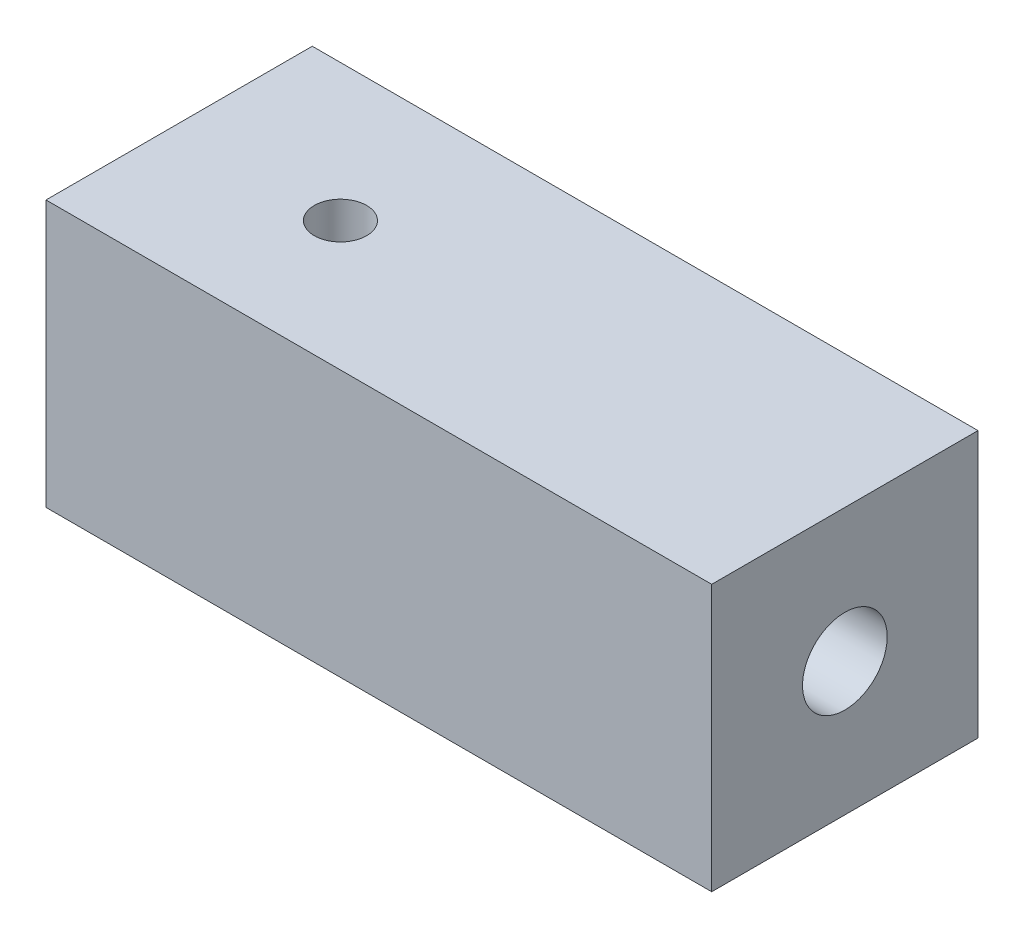
ISO-10303-21;
HEADER;
FILE_DESCRIPTION(('STEP AP214'),'2;1');
FILE_NAME('part.step','',(''),(''),'','','');
FILE_SCHEMA(('AUTOMOTIVE_DESIGN { 1 0 10303 214 1 1 1 1 }'));
ENDSEC;
DATA;
#1=APPLICATION_CONTEXT('core data for automotive mechanical design processes');
#2=APPLICATION_PROTOCOL_DEFINITION('international standard','automotive_design',2000,#1);
#3=PRODUCT_CONTEXT('',#1,'mechanical');
#4=PRODUCT('Part','Part','',(#3));
#5=PRODUCT_RELATED_PRODUCT_CATEGORY('part','',(#4));
#6=PRODUCT_DEFINITION_FORMATION('','',#4);
#7=PRODUCT_DEFINITION_CONTEXT('part definition',#1,'design');
#8=PRODUCT_DEFINITION('design','',#6,#7);
#9=PRODUCT_DEFINITION_SHAPE('','',#8);
#10=(LENGTH_UNIT() NAMED_UNIT(*) SI_UNIT(.MILLI.,.METRE.));
#11=(NAMED_UNIT(*) PLANE_ANGLE_UNIT() SI_UNIT($,.RADIAN.));
#12=(NAMED_UNIT(*) SI_UNIT($,.STERADIAN.) SOLID_ANGLE_UNIT());
#13=UNCERTAINTY_MEASURE_WITH_UNIT(LENGTH_MEASURE(1.E-05),#10,'distance_accuracy_value','');
#14=(GEOMETRIC_REPRESENTATION_CONTEXT(3) GLOBAL_UNCERTAINTY_ASSIGNED_CONTEXT((#13)) GLOBAL_UNIT_ASSIGNED_CONTEXT((#10,
#11,#12)) REPRESENTATION_CONTEXT('',''));
#15=CARTESIAN_POINT('',(0.,0.,0.));
#16=DIRECTION('',(0.,0.,1.));
#17=DIRECTION('',(1.,0.,0.));
#18=AXIS2_PLACEMENT_3D('',#15,#16,#17);
#19=CARTESIAN_POINT('',(31.75,0.,0.));
#20=DIRECTION('',(0.,0.,-1.));
#21=DIRECTION('',(-1.,0.,0.));
#22=AXIS2_PLACEMENT_3D('',#19,#20,#21);
#23=PLANE('',#22);
#24=DIRECTION('',(0.,-1.,0.));
#25=VECTOR('',#24,1.);
#26=CARTESIAN_POINT('',(0.,0.,0.));
#27=LINE('',#26,#25);
#28=CARTESIAN_POINT('',(0.,12.7,0.));
#29=VERTEX_POINT('',#28);
#30=CARTESIAN_POINT('',(0.,0.,0.));
#31=VERTEX_POINT('',#30);
#32=EDGE_CURVE('E94',#29,#31,#27,.T.);
#33=ORIENTED_EDGE('',*,*,#32,.T.);
#34=DIRECTION('',(-1.,0.,0.));
#35=VECTOR('',#34,1.);
#36=CARTESIAN_POINT('',(31.75,0.,0.));
#37=LINE('',#36,#35);
#38=CARTESIAN_POINT('',(31.75,0.,0.));
#39=VERTEX_POINT('',#38);
#40=EDGE_CURVE('E11',#39,#31,#37,.T.);
#41=ORIENTED_EDGE('',*,*,#40,.F.);
#42=DIRECTION('',(0.,-1.,0.));
#43=VECTOR('',#42,1.);
#44=CARTESIAN_POINT('',(31.75,0.,0.));
#45=LINE('',#44,#43);
#46=CARTESIAN_POINT('',(31.75,12.7,0.));
#47=VERTEX_POINT('',#46);
#48=EDGE_CURVE('E105',#47,#39,#45,.T.);
#49=ORIENTED_EDGE('',*,*,#48,.F.);
#50=DIRECTION('',(-1.,0.,0.));
#51=VECTOR('',#50,1.);
#52=CARTESIAN_POINT('',(31.75,12.7,0.));
#53=LINE('',#52,#51);
#54=EDGE_CURVE('E110',#47,#29,#53,.T.);
#55=ORIENTED_EDGE('',*,*,#54,.T.);
#56=EDGE_LOOP('',(#33,#41,#49,#55));
#57=FACE_BOUND('',#56,.T.);
#58=ADVANCED_FACE('F33',(#57),#23,.F.);
#59=CARTESIAN_POINT('',(31.75,0.,0.));
#60=DIRECTION('',(0.,1.,0.));
#61=DIRECTION('',(0.,0.,1.));
#62=AXIS2_PLACEMENT_3D('',#59,#60,#61);
#63=PLANE('',#62);
#64=CARTESIAN_POINT('',(7.874,0.,-6.17033471428086));
#65=DIRECTION('',(0.,-1.,0.));
#66=DIRECTION('',(0.,0.,-1.));
#67=AXIS2_PLACEMENT_3D('',#64,#65,#66);
#68=CIRCLE('',#67,1.25);
#69=CARTESIAN_POINT('',(7.874,0.,-7.42033471428085));
#70=VERTEX_POINT('',#69);
#71=EDGE_CURVE('E148',#70,#70,#68,.T.);
#72=ORIENTED_EDGE('',*,*,#71,.F.);
#73=EDGE_LOOP('',(#72));
#74=FACE_BOUND('',#73,.T.);
#75=DIRECTION('',(0.,0.,-1.));
#76=VECTOR('',#75,1.);
#77=CARTESIAN_POINT('',(0.,0.,0.));
#78=LINE('',#77,#76);
#79=CARTESIAN_POINT('',(0.,0.,-12.7));
#80=VERTEX_POINT('',#79);
#81=EDGE_CURVE('E98',#31,#80,#78,.T.);
#82=ORIENTED_EDGE('',*,*,#81,.T.);
#83=DIRECTION('',(-1.,0.,0.));
#84=VECTOR('',#83,1.);
#85=CARTESIAN_POINT('',(31.75,0.,-12.7));
#86=LINE('',#85,#84);
#87=CARTESIAN_POINT('',(31.75,0.,-12.7));
#88=VERTEX_POINT('',#87);
#89=EDGE_CURVE('E41',#88,#80,#86,.T.);
#90=ORIENTED_EDGE('',*,*,#89,.F.);
#91=DIRECTION('',(0.,0.,-1.));
#92=VECTOR('',#91,1.);
#93=CARTESIAN_POINT('',(31.75,0.,0.));
#94=LINE('',#93,#92);
#95=EDGE_CURVE('E80',#39,#88,#94,.T.);
#96=ORIENTED_EDGE('',*,*,#95,.F.);
#97=ORIENTED_EDGE('',*,*,#40,.T.);
#98=EDGE_LOOP('',(#82,#90,#96,#97));
#99=FACE_BOUND('',#98,.T.);
#100=ADVANCED_FACE('F135',(#74,#99),#63,.F.);
#101=CARTESIAN_POINT('',(31.75,0.,-12.7));
#102=DIRECTION('',(0.,0.,1.));
#103=DIRECTION('',(1.,0.,0.));
#104=AXIS2_PLACEMENT_3D('',#101,#102,#103);
#105=PLANE('',#104);
#106=DIRECTION('',(0.,1.,0.));
#107=VECTOR('',#106,1.);
#108=CARTESIAN_POINT('',(0.,0.,-12.7));
#109=LINE('',#108,#107);
#110=CARTESIAN_POINT('',(0.,12.7,-12.7));
#111=VERTEX_POINT('',#110);
#112=EDGE_CURVE('E67',#80,#111,#109,.T.);
#113=ORIENTED_EDGE('',*,*,#112,.T.);
#114=DIRECTION('',(-1.,0.,0.));
#115=VECTOR('',#114,1.);
#116=CARTESIAN_POINT('',(31.75,12.7,-12.7));
#117=LINE('',#116,#115);
#118=CARTESIAN_POINT('',(31.75,12.7,-12.7));
#119=VERTEX_POINT('',#118);
#120=EDGE_CURVE('E116',#119,#111,#117,.T.);
#121=ORIENTED_EDGE('',*,*,#120,.F.);
#122=DIRECTION('',(0.,1.,0.));
#123=VECTOR('',#122,1.);
#124=CARTESIAN_POINT('',(31.75,0.,-12.7));
#125=LINE('',#124,#123);
#126=EDGE_CURVE('E108',#88,#119,#125,.T.);
#127=ORIENTED_EDGE('',*,*,#126,.F.);
#128=ORIENTED_EDGE('',*,*,#89,.T.);
#129=EDGE_LOOP('',(#113,#121,#127,#128));
#130=FACE_BOUND('',#129,.T.);
#131=ADVANCED_FACE('F118',(#130),#105,.F.);
#132=CARTESIAN_POINT('',(31.75,12.7,0.));
#133=DIRECTION('',(0.,-1.,0.));
#134=DIRECTION('',(0.,0.,-1.));
#135=AXIS2_PLACEMENT_3D('',#132,#133,#134);
#136=PLANE('',#135);
#137=CARTESIAN_POINT('',(7.874,12.7,-6.17033471428086));
#138=DIRECTION('',(0.,-1.,0.));
#139=DIRECTION('',(0.,0.,-1.));
#140=AXIS2_PLACEMENT_3D('',#137,#138,#139);
#141=CIRCLE('',#140,1.25);
#142=CARTESIAN_POINT('',(7.874,12.7,-7.42033471428085));
#143=VERTEX_POINT('',#142);
#144=EDGE_CURVE('E101',#143,#143,#141,.T.);
#145=ORIENTED_EDGE('',*,*,#144,.T.);
#146=EDGE_LOOP('',(#145));
#147=FACE_BOUND('',#146,.T.);
#148=DIRECTION('',(0.,0.,1.));
#149=VECTOR('',#148,1.);
#150=CARTESIAN_POINT('',(0.,12.7,0.));
#151=LINE('',#150,#149);
#152=EDGE_CURVE('E73',#111,#29,#151,.T.);
#153=ORIENTED_EDGE('',*,*,#152,.T.);
#154=ORIENTED_EDGE('',*,*,#54,.F.);
#155=DIRECTION('',(0.,0.,1.));
#156=VECTOR('',#155,1.);
#157=CARTESIAN_POINT('',(31.75,12.7,0.));
#158=LINE('',#157,#156);
#159=EDGE_CURVE('E49',#119,#47,#158,.T.);
#160=ORIENTED_EDGE('',*,*,#159,.F.);
#161=ORIENTED_EDGE('',*,*,#120,.T.);
#162=EDGE_LOOP('',(#153,#154,#160,#161));
#163=FACE_BOUND('',#162,.T.);
#164=ADVANCED_FACE('F124',(#147,#163),#136,.F.);
#165=CARTESIAN_POINT('',(31.75,0.,0.));
#166=DIRECTION('',(-1.,0.,0.));
#167=DIRECTION('',(0.,0.,1.));
#168=AXIS2_PLACEMENT_3D('',#165,#166,#167);
#169=PLANE('',#168);
#170=CARTESIAN_POINT('',(31.75,6.35,-6.35));
#171=DIRECTION('',(1.,0.,0.));
#172=DIRECTION('',(0.,0.,-1.));
#173=AXIS2_PLACEMENT_3D('',#170,#171,#172);
#174=CIRCLE('',#173,2.01929999999999);
#175=CARTESIAN_POINT('',(31.75,6.35,-8.36929999999999));
#176=VERTEX_POINT('',#175);
#177=EDGE_CURVE('E95',#176,#176,#174,.T.);
#178=ORIENTED_EDGE('',*,*,#177,.F.);
#179=EDGE_LOOP('',(#178));
#180=FACE_BOUND('',#179,.T.);
#181=ORIENTED_EDGE('',*,*,#48,.T.);
#182=ORIENTED_EDGE('',*,*,#95,.T.);
#183=ORIENTED_EDGE('',*,*,#126,.T.);
#184=ORIENTED_EDGE('',*,*,#159,.T.);
#185=EDGE_LOOP('',(#181,#182,#183,#184));
#186=FACE_BOUND('',#185,.T.);
#187=ADVANCED_FACE('F126',(#180,#186),#169,.F.);
#188=CARTESIAN_POINT('',(0.,0.,0.));
#189=DIRECTION('',(-1.,0.,0.));
#190=DIRECTION('',(0.,0.,1.));
#191=AXIS2_PLACEMENT_3D('',#188,#189,#190);
#192=PLANE('',#191);
#193=ORIENTED_EDGE('',*,*,#32,.F.);
#194=ORIENTED_EDGE('',*,*,#152,.F.);
#195=ORIENTED_EDGE('',*,*,#112,.F.);
#196=ORIENTED_EDGE('',*,*,#81,.F.);
#197=EDGE_LOOP('',(#193,#194,#195,#196));
#198=FACE_BOUND('',#197,.T.);
#199=ADVANCED_FACE('F88',(#198),#192,.T.);
#200=CARTESIAN_POINT('',(19.812,6.35,-6.35));
#201=DIRECTION('',(1.,0.,0.));
#202=DIRECTION('',(0.,0.,-1.));
#203=AXIS2_PLACEMENT_3D('',#200,#201,#202);
#204=CONICAL_SURFACE('',#203,2.01929999999999,1.02974425867665);
#205=CARTESIAN_POINT('',(18.5986821519977,6.35,-6.35));
#206=VERTEX_POINT('',#205);
#207=VERTEX_LOOP('',#206);
#208=FACE_BOUND('',#207,.T.);
#209=CARTESIAN_POINT('',(19.812,6.35,-6.35));
#210=DIRECTION('',(1.,0.,0.));
#211=DIRECTION('',(0.,0.,-1.));
#212=AXIS2_PLACEMENT_3D('',#209,#210,#211);
#213=CIRCLE('',#212,2.01929999999999);
#214=CARTESIAN_POINT('',(19.812,6.35,-8.36929999999999));
#215=VERTEX_POINT('',#214);
#216=EDGE_CURVE('E92',#215,#215,#213,.T.);
#217=ORIENTED_EDGE('',*,*,#216,.T.);
#218=EDGE_LOOP('',(#217));
#219=FACE_BOUND('',#218,.T.);
#220=ADVANCED_FACE('F84',(#208,#219),#204,.F.);
#221=CARTESIAN_POINT('',(31.75,6.35,-6.35));
#222=DIRECTION('',(1.,0.,0.));
#223=DIRECTION('',(0.,0.,-1.));
#224=AXIS2_PLACEMENT_3D('',#221,#222,#223);
#225=CYLINDRICAL_SURFACE('',#224,2.01929999999999);
#226=ORIENTED_EDGE('',*,*,#216,.F.);
#227=EDGE_LOOP('',(#226));
#228=FACE_BOUND('',#227,.T.);
#229=ORIENTED_EDGE('',*,*,#177,.T.);
#230=EDGE_LOOP('',(#229));
#231=FACE_BOUND('',#230,.T.);
#232=ADVANCED_FACE('F87',(#228,#231),#225,.F.);
#233=CARTESIAN_POINT('',(7.874,0.,-6.17033471428086));
#234=DIRECTION('',(0.,-1.,0.));
#235=DIRECTION('',(0.,0.,-1.));
#236=AXIS2_PLACEMENT_3D('',#233,#234,#235);
#237=CYLINDRICAL_SURFACE('',#236,1.25);
#238=ORIENTED_EDGE('',*,*,#144,.F.);
#239=EDGE_LOOP('',(#238));
#240=FACE_BOUND('',#239,.T.);
#241=ORIENTED_EDGE('',*,*,#71,.T.);
#242=EDGE_LOOP('',(#241));
#243=FACE_BOUND('',#242,.T.);
#244=ADVANCED_FACE('F153',(#240,#243),#237,.F.);
#245=CLOSED_SHELL('',(#58,#100,#131,#164,#187,#199,#220,#232,#244));
#246=MANIFOLD_SOLID_BREP('B2',#245);
#247=ADVANCED_BREP_SHAPE_REPRESENTATION('',(#18,#246),#14);
#248=SHAPE_DEFINITION_REPRESENTATION(#9,#247);
ENDSEC;
END-ISO-10303-21;
